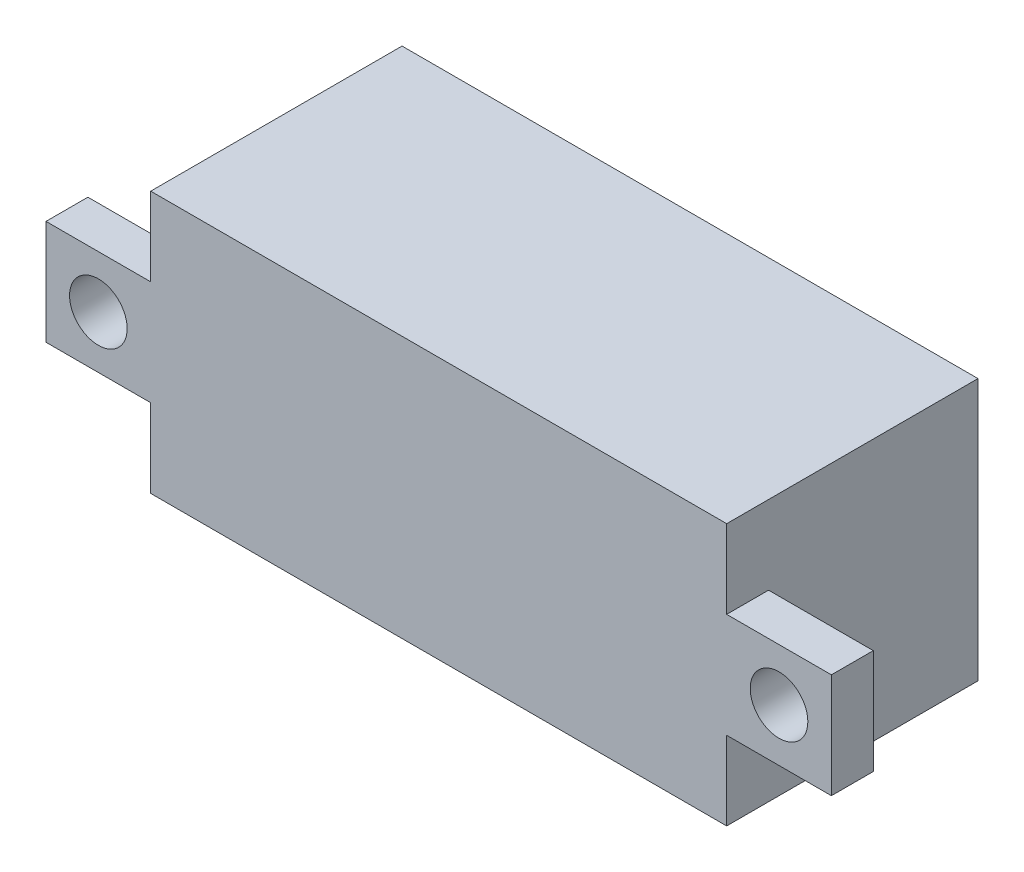
ISO-10303-21;
HEADER;
FILE_DESCRIPTION(('STEP AP214'),'2;1');
FILE_NAME('part.step','',(''),(''),'','','');
FILE_SCHEMA(('AUTOMOTIVE_DESIGN { 1 0 10303 214 1 1 1 1 }'));
ENDSEC;
DATA;
#1=APPLICATION_CONTEXT('core data for automotive mechanical design processes');
#2=APPLICATION_PROTOCOL_DEFINITION('international standard','automotive_design',2000,#1);
#3=PRODUCT_CONTEXT('',#1,'mechanical');
#4=PRODUCT('Part','Part','',(#3));
#5=PRODUCT_RELATED_PRODUCT_CATEGORY('part','',(#4));
#6=PRODUCT_DEFINITION_FORMATION('','',#4);
#7=PRODUCT_DEFINITION_CONTEXT('part definition',#1,'design');
#8=PRODUCT_DEFINITION('design','',#6,#7);
#9=PRODUCT_DEFINITION_SHAPE('','',#8);
#10=(LENGTH_UNIT() NAMED_UNIT(*) SI_UNIT(.MILLI.,.METRE.));
#11=(NAMED_UNIT(*) PLANE_ANGLE_UNIT() SI_UNIT($,.RADIAN.));
#12=(NAMED_UNIT(*) SI_UNIT($,.STERADIAN.) SOLID_ANGLE_UNIT());
#13=UNCERTAINTY_MEASURE_WITH_UNIT(LENGTH_MEASURE(1.E-05),#10,'distance_accuracy_value','');
#14=(GEOMETRIC_REPRESENTATION_CONTEXT(3) GLOBAL_UNCERTAINTY_ASSIGNED_CONTEXT((#13)) GLOBAL_UNIT_ASSIGNED_CONTEXT((#10,
#11,#12)) REPRESENTATION_CONTEXT('',''));
#15=CARTESIAN_POINT('',(0.,0.,0.));
#16=DIRECTION('',(0.,0.,1.));
#17=DIRECTION('',(1.,0.,0.));
#18=AXIS2_PLACEMENT_3D('',#15,#16,#17);
#19=CARTESIAN_POINT('',(0.,0.,8.));
#20=DIRECTION('',(1.,0.,0.));
#21=DIRECTION('',(0.,0.,-1.));
#22=AXIS2_PLACEMENT_3D('',#19,#20,#21);
#23=PLANE('',#22);
#24=DIRECTION('',(0.,-1.,0.));
#25=VECTOR('',#24,1.);
#26=CARTESIAN_POINT('',(0.,0.,0.));
#27=LINE('',#26,#25);
#28=CARTESIAN_POINT('',(0.,10.,0.));
#29=VERTEX_POINT('',#28);
#30=CARTESIAN_POINT('',(0.,0.,0.));
#31=VERTEX_POINT('',#30);
#32=EDGE_CURVE('E157',#29,#31,#27,.T.);
#33=ORIENTED_EDGE('',*,*,#32,.T.);
#34=DIRECTION('',(0.,0.,-1.));
#35=VECTOR('',#34,1.);
#36=CARTESIAN_POINT('',(0.,0.,8.));
#37=LINE('',#36,#35);
#38=CARTESIAN_POINT('',(0.,0.,9.6));
#39=VERTEX_POINT('',#38);
#40=EDGE_CURVE('E11',#39,#31,#37,.T.);
#41=ORIENTED_EDGE('',*,*,#40,.F.);
#42=DIRECTION('',(0.,-1.,0.));
#43=VECTOR('',#42,1.);
#44=CARTESIAN_POINT('',(0.,3.,9.6));
#45=LINE('',#44,#43);
#46=CARTESIAN_POINT('',(0.,3.,9.6));
#47=VERTEX_POINT('',#46);
#48=EDGE_CURVE('E192',#47,#39,#45,.T.);
#49=ORIENTED_EDGE('',*,*,#48,.F.);
#50=DIRECTION('',(0.,0.,-1.));
#51=VECTOR('',#50,1.);
#52=CARTESIAN_POINT('',(0.,3.,9.6));
#53=LINE('',#52,#51);
#54=CARTESIAN_POINT('',(0.,3.,8.));
#55=VERTEX_POINT('',#54);
#56=EDGE_CURVE('E235',#47,#55,#53,.T.);
#57=ORIENTED_EDGE('',*,*,#56,.T.);
#58=DIRECTION('',(0.,-1.,0.));
#59=VECTOR('',#58,1.);
#60=CARTESIAN_POINT('',(0.,0.,8.));
#61=LINE('',#60,#59);
#62=CARTESIAN_POINT('',(0.,7.,8.));
#63=VERTEX_POINT('',#62);
#64=EDGE_CURVE('E155',#63,#55,#61,.T.);
#65=ORIENTED_EDGE('',*,*,#64,.F.);
#66=DIRECTION('',(0.,0.,-1.));
#67=VECTOR('',#66,1.);
#68=CARTESIAN_POINT('',(0.,7.,9.6));
#69=LINE('',#68,#67);
#70=CARTESIAN_POINT('',(0.,7.,9.6));
#71=VERTEX_POINT('',#70);
#72=EDGE_CURVE('E134',#71,#63,#69,.T.);
#73=ORIENTED_EDGE('',*,*,#72,.F.);
#74=DIRECTION('',(0.,-1.,0.));
#75=VECTOR('',#74,1.);
#76=CARTESIAN_POINT('',(0.,10.,9.6));
#77=LINE('',#76,#75);
#78=CARTESIAN_POINT('',(0.,10.,9.6));
#79=VERTEX_POINT('',#78);
#80=EDGE_CURVE('E140',#79,#71,#77,.T.);
#81=ORIENTED_EDGE('',*,*,#80,.F.);
#82=DIRECTION('',(0.,0.,-1.));
#83=VECTOR('',#82,1.);
#84=CARTESIAN_POINT('',(0.,10.,8.));
#85=LINE('',#84,#83);
#86=EDGE_CURVE('E167',#79,#29,#85,.T.);
#87=ORIENTED_EDGE('',*,*,#86,.T.);
#88=EDGE_LOOP('',(#33,#41,#49,#57,#65,#73,#81,#87));
#89=FACE_BOUND('',#88,.T.);
#90=ADVANCED_FACE('F41',(#89),#23,.F.);
#91=CARTESIAN_POINT('',(0.,0.,8.));
#92=DIRECTION('',(0.,1.,0.));
#93=DIRECTION('',(0.,0.,1.));
#94=AXIS2_PLACEMENT_3D('',#91,#92,#93);
#95=PLANE('',#94);
#96=DIRECTION('',(1.,0.,0.));
#97=VECTOR('',#96,1.);
#98=CARTESIAN_POINT('',(0.,0.,0.));
#99=LINE('',#98,#97);
#100=CARTESIAN_POINT('',(22.,0.,0.));
#101=VERTEX_POINT('',#100);
#102=EDGE_CURVE('E159',#31,#101,#99,.T.);
#103=ORIENTED_EDGE('',*,*,#102,.T.);
#104=DIRECTION('',(0.,0.,-1.));
#105=VECTOR('',#104,1.);
#106=CARTESIAN_POINT('',(22.,0.,8.));
#107=LINE('',#106,#105);
#108=CARTESIAN_POINT('',(22.,0.,9.6));
#109=VERTEX_POINT('',#108);
#110=EDGE_CURVE('E48',#109,#101,#107,.T.);
#111=ORIENTED_EDGE('',*,*,#110,.F.);
#112=DIRECTION('',(1.,0.,0.));
#113=VECTOR('',#112,1.);
#114=CARTESIAN_POINT('',(0.,0.,9.6));
#115=LINE('',#114,#113);
#116=EDGE_CURVE('E193',#39,#109,#115,.T.);
#117=ORIENTED_EDGE('',*,*,#116,.F.);
#118=ORIENTED_EDGE('',*,*,#40,.T.);
#119=EDGE_LOOP('',(#103,#111,#117,#118));
#120=FACE_BOUND('',#119,.T.);
#121=ADVANCED_FACE('F198',(#120),#95,.F.);
#122=CARTESIAN_POINT('',(22.,0.,8.));
#123=DIRECTION('',(-1.,0.,0.));
#124=DIRECTION('',(0.,0.,1.));
#125=AXIS2_PLACEMENT_3D('',#122,#123,#124);
#126=PLANE('',#125);
#127=DIRECTION('',(0.,1.,0.));
#128=VECTOR('',#127,1.);
#129=CARTESIAN_POINT('',(22.,0.,0.));
#130=LINE('',#129,#128);
#131=CARTESIAN_POINT('',(22.,10.,0.));
#132=VERTEX_POINT('',#131);
#133=EDGE_CURVE('E170',#101,#132,#130,.T.);
#134=ORIENTED_EDGE('',*,*,#133,.T.);
#135=DIRECTION('',(0.,0.,-1.));
#136=VECTOR('',#135,1.);
#137=CARTESIAN_POINT('',(22.,10.,8.));
#138=LINE('',#137,#136);
#139=CARTESIAN_POINT('',(22.,10.,9.6));
#140=VERTEX_POINT('',#139);
#141=EDGE_CURVE('E174',#140,#132,#138,.T.);
#142=ORIENTED_EDGE('',*,*,#141,.F.);
#143=DIRECTION('',(0.,1.,0.));
#144=VECTOR('',#143,1.);
#145=CARTESIAN_POINT('',(22.,7.,9.6));
#146=LINE('',#145,#144);
#147=CARTESIAN_POINT('',(22.,7.,9.6));
#148=VERTEX_POINT('',#147);
#149=EDGE_CURVE('E209',#148,#140,#146,.T.);
#150=ORIENTED_EDGE('',*,*,#149,.F.);
#151=DIRECTION('',(0.,0.,-1.));
#152=VECTOR('',#151,1.);
#153=CARTESIAN_POINT('',(22.,7.,9.6));
#154=LINE('',#153,#152);
#155=CARTESIAN_POINT('',(22.,7.,8.));
#156=VERTEX_POINT('',#155);
#157=EDGE_CURVE('E212',#148,#156,#154,.T.);
#158=ORIENTED_EDGE('',*,*,#157,.T.);
#159=DIRECTION('',(0.,1.,0.));
#160=VECTOR('',#159,1.);
#161=CARTESIAN_POINT('',(22.,0.,8.));
#162=LINE('',#161,#160);
#163=CARTESIAN_POINT('',(22.,3.,8.));
#164=VERTEX_POINT('',#163);
#165=EDGE_CURVE('E55',#164,#156,#162,.T.);
#166=ORIENTED_EDGE('',*,*,#165,.F.);
#167=DIRECTION('',(0.,0.,-1.));
#168=VECTOR('',#167,1.);
#169=CARTESIAN_POINT('',(22.,3.,9.6));
#170=LINE('',#169,#168);
#171=CARTESIAN_POINT('',(22.,3.,9.6));
#172=VERTEX_POINT('',#171);
#173=EDGE_CURVE('E233',#172,#164,#170,.T.);
#174=ORIENTED_EDGE('',*,*,#173,.F.);
#175=DIRECTION('',(0.,1.,0.));
#176=VECTOR('',#175,1.);
#177=CARTESIAN_POINT('',(22.,0.,9.6));
#178=LINE('',#177,#176);
#179=EDGE_CURVE('E180',#109,#172,#178,.T.);
#180=ORIENTED_EDGE('',*,*,#179,.F.);
#181=ORIENTED_EDGE('',*,*,#110,.T.);
#182=EDGE_LOOP('',(#134,#142,#150,#158,#166,#174,#180,#181));
#183=FACE_BOUND('',#182,.T.);
#184=ADVANCED_FACE('F179',(#183),#126,.F.);
#185=CARTESIAN_POINT('',(0.,10.,8.));
#186=DIRECTION('',(0.,-1.,0.));
#187=DIRECTION('',(0.,0.,-1.));
#188=AXIS2_PLACEMENT_3D('',#185,#186,#187);
#189=PLANE('',#188);
#190=DIRECTION('',(-1.,0.,0.));
#191=VECTOR('',#190,1.);
#192=CARTESIAN_POINT('',(0.,10.,0.));
#193=LINE('',#192,#191);
#194=EDGE_CURVE('E166',#132,#29,#193,.T.);
#195=ORIENTED_EDGE('',*,*,#194,.T.);
#196=ORIENTED_EDGE('',*,*,#86,.F.);
#197=DIRECTION('',(-1.,0.,0.));
#198=VECTOR('',#197,1.);
#199=CARTESIAN_POINT('',(22.,10.,9.6));
#200=LINE('',#199,#198);
#201=EDGE_CURVE('E148',#140,#79,#200,.T.);
#202=ORIENTED_EDGE('',*,*,#201,.F.);
#203=ORIENTED_EDGE('',*,*,#141,.T.);
#204=EDGE_LOOP('',(#195,#196,#202,#203));
#205=FACE_BOUND('',#204,.T.);
#206=ADVANCED_FACE('F189',(#205),#189,.F.);
#207=CARTESIAN_POINT('',(0.,0.,0.));
#208=DIRECTION('',(0.,0.,-1.));
#209=DIRECTION('',(-1.,0.,0.));
#210=AXIS2_PLACEMENT_3D('',#207,#208,#209);
#211=PLANE('',#210);
#212=ORIENTED_EDGE('',*,*,#32,.F.);
#213=ORIENTED_EDGE('',*,*,#194,.F.);
#214=ORIENTED_EDGE('',*,*,#133,.F.);
#215=ORIENTED_EDGE('',*,*,#102,.F.);
#216=EDGE_LOOP('',(#212,#213,#214,#215));
#217=FACE_BOUND('',#216,.T.);
#218=ADVANCED_FACE('F187',(#217),#211,.T.);
#219=CARTESIAN_POINT('',(0.,0.,8.));
#220=DIRECTION('',(0.,0.,-1.));
#221=DIRECTION('',(-1.,0.,0.));
#222=AXIS2_PLACEMENT_3D('',#219,#220,#221);
#223=PLANE('',#222);
#224=CARTESIAN_POINT('',(-2.,5.,8.));
#225=DIRECTION('',(0.,0.,1.));
#226=DIRECTION('',(1.,0.,0.));
#227=AXIS2_PLACEMENT_3D('',#224,#225,#226);
#228=CIRCLE('',#227,1.1);
#229=CARTESIAN_POINT('',(-0.9,5.,8.));
#230=VERTEX_POINT('',#229);
#231=EDGE_CURVE('E248',#230,#230,#228,.T.);
#232=ORIENTED_EDGE('',*,*,#231,.T.);
#233=EDGE_LOOP('',(#232));
#234=FACE_BOUND('',#233,.T.);
#235=DIRECTION('',(-1.,0.,0.));
#236=VECTOR('',#235,1.);
#237=CARTESIAN_POINT('',(0.,7.,8.));
#238=LINE('',#237,#236);
#239=CARTESIAN_POINT('',(-4.,7.,8.));
#240=VERTEX_POINT('',#239);
#241=EDGE_CURVE('E213',#63,#240,#238,.T.);
#242=ORIENTED_EDGE('',*,*,#241,.F.);
#243=ORIENTED_EDGE('',*,*,#64,.T.);
#244=DIRECTION('',(1.,0.,0.));
#245=VECTOR('',#244,1.);
#246=CARTESIAN_POINT('',(0.,3.,8.));
#247=LINE('',#246,#245);
#248=CARTESIAN_POINT('',(-4.,3.,8.));
#249=VERTEX_POINT('',#248);
#250=EDGE_CURVE('E218',#249,#55,#247,.T.);
#251=ORIENTED_EDGE('',*,*,#250,.F.);
#252=DIRECTION('',(0.,-1.,0.));
#253=VECTOR('',#252,1.);
#254=CARTESIAN_POINT('',(-4.,7.,8.));
#255=LINE('',#254,#253);
#256=EDGE_CURVE('E215',#240,#249,#255,.T.);
#257=ORIENTED_EDGE('',*,*,#256,.F.);
#258=EDGE_LOOP('',(#242,#243,#251,#257));
#259=FACE_BOUND('',#258,.T.);
#260=ADVANCED_FACE('F244',(#234,#259),#223,.T.);
#261=CARTESIAN_POINT('',(0.,0.,9.6));
#262=DIRECTION('',(0.,0.,-1.));
#263=DIRECTION('',(-1.,0.,0.));
#264=AXIS2_PLACEMENT_3D('',#261,#262,#263);
#265=PLANE('',#264);
#266=ORIENTED_EDGE('',*,*,#80,.T.);
#267=DIRECTION('',(-1.,0.,0.));
#268=VECTOR('',#267,1.);
#269=CARTESIAN_POINT('',(0.,7.,9.6));
#270=LINE('',#269,#268);
#271=CARTESIAN_POINT('',(-4.,7.,9.6));
#272=VERTEX_POINT('',#271);
#273=EDGE_CURVE('E130',#71,#272,#270,.T.);
#274=ORIENTED_EDGE('',*,*,#273,.T.);
#275=DIRECTION('',(0.,-1.,0.));
#276=VECTOR('',#275,1.);
#277=CARTESIAN_POINT('',(-4.,7.,9.6));
#278=LINE('',#277,#276);
#279=CARTESIAN_POINT('',(-4.,3.,9.6));
#280=VERTEX_POINT('',#279);
#281=EDGE_CURVE('E139',#272,#280,#278,.T.);
#282=ORIENTED_EDGE('',*,*,#281,.T.);
#283=DIRECTION('',(1.,0.,0.));
#284=VECTOR('',#283,1.);
#285=CARTESIAN_POINT('',(0.,3.,9.6));
#286=LINE('',#285,#284);
#287=EDGE_CURVE('E195',#280,#47,#286,.T.);
#288=ORIENTED_EDGE('',*,*,#287,.T.);
#289=ORIENTED_EDGE('',*,*,#48,.T.);
#290=ORIENTED_EDGE('',*,*,#116,.T.);
#291=ORIENTED_EDGE('',*,*,#179,.T.);
#292=DIRECTION('',(1.,0.,0.));
#293=VECTOR('',#292,1.);
#294=CARTESIAN_POINT('',(22.,3.,9.6));
#295=LINE('',#294,#293);
#296=CARTESIAN_POINT('',(26.,3.,9.6));
#297=VERTEX_POINT('',#296);
#298=EDGE_CURVE('E200',#172,#297,#295,.T.);
#299=ORIENTED_EDGE('',*,*,#298,.T.);
#300=DIRECTION('',(0.,1.,0.));
#301=VECTOR('',#300,1.);
#302=CARTESIAN_POINT('',(26.,7.,9.6));
#303=LINE('',#302,#301);
#304=CARTESIAN_POINT('',(26.,7.,9.6));
#305=VERTEX_POINT('',#304);
#306=EDGE_CURVE('E205',#297,#305,#303,.T.);
#307=ORIENTED_EDGE('',*,*,#306,.T.);
#308=DIRECTION('',(-1.,0.,0.));
#309=VECTOR('',#308,1.);
#310=CARTESIAN_POINT('',(22.,7.,9.6));
#311=LINE('',#310,#309);
#312=EDGE_CURVE('E207',#305,#148,#311,.T.);
#313=ORIENTED_EDGE('',*,*,#312,.T.);
#314=ORIENTED_EDGE('',*,*,#149,.T.);
#315=ORIENTED_EDGE('',*,*,#201,.T.);
#316=EDGE_LOOP('',(#266,#274,#282,#288,#289,#290,#291,#299,#307,#313,#314,#315));
#317=FACE_BOUND('',#316,.T.);
#318=CARTESIAN_POINT('',(-2.,5.,9.6));
#319=DIRECTION('',(0.,0.,1.));
#320=DIRECTION('',(1.,0.,0.));
#321=AXIS2_PLACEMENT_3D('',#318,#319,#320);
#322=CIRCLE('',#321,1.1);
#323=CARTESIAN_POINT('',(-0.9,5.,9.6));
#324=VERTEX_POINT('',#323);
#325=EDGE_CURVE('E216',#324,#324,#322,.T.);
#326=ORIENTED_EDGE('',*,*,#325,.F.);
#327=EDGE_LOOP('',(#326));
#328=FACE_BOUND('',#327,.T.);
#329=CARTESIAN_POINT('',(24.,5.,9.6));
#330=DIRECTION('',(0.,0.,1.));
#331=DIRECTION('',(1.,0.,0.));
#332=AXIS2_PLACEMENT_3D('',#329,#330,#331);
#333=CIRCLE('',#332,1.1);
#334=CARTESIAN_POINT('',(25.1,5.,9.6));
#335=VERTEX_POINT('',#334);
#336=EDGE_CURVE('E251',#335,#335,#333,.T.);
#337=ORIENTED_EDGE('',*,*,#336,.F.);
#338=EDGE_LOOP('',(#337));
#339=FACE_BOUND('',#338,.T.);
#340=ADVANCED_FACE('F144',(#317,#328,#339),#265,.F.);
#341=DIRECTION('',(1.,0.,0.));
#342=VECTOR('',#341,1.);
#343=CARTESIAN_POINT('',(22.,3.,8.));
#344=LINE('',#343,#342);
#345=CARTESIAN_POINT('',(26.,3.,8.));
#346=VERTEX_POINT('',#345);
#347=EDGE_CURVE('E221',#164,#346,#344,.T.);
#348=ORIENTED_EDGE('',*,*,#347,.F.);
#349=ORIENTED_EDGE('',*,*,#165,.T.);
#350=DIRECTION('',(-1.,0.,0.));
#351=VECTOR('',#350,1.);
#352=CARTESIAN_POINT('',(22.,7.,8.));
#353=LINE('',#352,#351);
#354=CARTESIAN_POINT('',(26.,7.,8.));
#355=VERTEX_POINT('',#354);
#356=EDGE_CURVE('E151',#355,#156,#353,.T.);
#357=ORIENTED_EDGE('',*,*,#356,.F.);
#358=DIRECTION('',(0.,1.,0.));
#359=VECTOR('',#358,1.);
#360=CARTESIAN_POINT('',(26.,7.,8.));
#361=LINE('',#360,#359);
#362=EDGE_CURVE('E223',#346,#355,#361,.T.);
#363=ORIENTED_EDGE('',*,*,#362,.F.);
#364=EDGE_LOOP('',(#348,#349,#357,#363));
#365=FACE_BOUND('',#364,.T.);
#366=CARTESIAN_POINT('',(24.,5.,8.));
#367=DIRECTION('',(0.,0.,1.));
#368=DIRECTION('',(1.,0.,0.));
#369=AXIS2_PLACEMENT_3D('',#366,#367,#368);
#370=CIRCLE('',#369,1.1);
#371=CARTESIAN_POINT('',(25.1,5.,8.));
#372=VERTEX_POINT('',#371);
#373=EDGE_CURVE('E254',#372,#372,#370,.T.);
#374=ORIENTED_EDGE('',*,*,#373,.T.);
#375=EDGE_LOOP('',(#374));
#376=FACE_BOUND('',#375,.T.);
#377=ADVANCED_FACE('F264',(#365,#376),#223,.T.);
#378=CARTESIAN_POINT('',(0.,7.,9.6));
#379=DIRECTION('',(0.,-1.,0.));
#380=DIRECTION('',(1.,0.,0.));
#381=AXIS2_PLACEMENT_3D('',#378,#379,#380);
#382=PLANE('',#381);
#383=ORIENTED_EDGE('',*,*,#241,.T.);
#384=DIRECTION('',(0.,0.,-1.));
#385=VECTOR('',#384,1.);
#386=CARTESIAN_POINT('',(-4.,7.,9.6));
#387=LINE('',#386,#385);
#388=EDGE_CURVE('E136',#272,#240,#387,.T.);
#389=ORIENTED_EDGE('',*,*,#388,.F.);
#390=ORIENTED_EDGE('',*,*,#273,.F.);
#391=ORIENTED_EDGE('',*,*,#72,.T.);
#392=EDGE_LOOP('',(#383,#389,#390,#391));
#393=FACE_BOUND('',#392,.T.);
#394=ADVANCED_FACE('F132',(#393),#382,.F.);
#395=CARTESIAN_POINT('',(-4.,7.,9.6));
#396=DIRECTION('',(1.,0.,0.));
#397=DIRECTION('',(0.,1.,0.));
#398=AXIS2_PLACEMENT_3D('',#395,#396,#397);
#399=PLANE('',#398);
#400=ORIENTED_EDGE('',*,*,#256,.T.);
#401=DIRECTION('',(0.,0.,-1.));
#402=VECTOR('',#401,1.);
#403=CARTESIAN_POINT('',(-4.,3.,9.6));
#404=LINE('',#403,#402);
#405=EDGE_CURVE('E161',#280,#249,#404,.T.);
#406=ORIENTED_EDGE('',*,*,#405,.F.);
#407=ORIENTED_EDGE('',*,*,#281,.F.);
#408=ORIENTED_EDGE('',*,*,#388,.T.);
#409=EDGE_LOOP('',(#400,#406,#407,#408));
#410=FACE_BOUND('',#409,.T.);
#411=ADVANCED_FACE('F245',(#410),#399,.F.);
#412=CARTESIAN_POINT('',(0.,3.,9.6));
#413=DIRECTION('',(0.,1.,0.));
#414=DIRECTION('',(-1.,0.,0.));
#415=AXIS2_PLACEMENT_3D('',#412,#413,#414);
#416=PLANE('',#415);
#417=ORIENTED_EDGE('',*,*,#250,.T.);
#418=ORIENTED_EDGE('',*,*,#56,.F.);
#419=ORIENTED_EDGE('',*,*,#287,.F.);
#420=ORIENTED_EDGE('',*,*,#405,.T.);
#421=EDGE_LOOP('',(#417,#418,#419,#420));
#422=FACE_BOUND('',#421,.T.);
#423=ADVANCED_FACE('F240',(#422),#416,.F.);
#424=CARTESIAN_POINT('',(22.,3.,9.6));
#425=DIRECTION('',(0.,1.,0.));
#426=DIRECTION('',(0.,0.,1.));
#427=AXIS2_PLACEMENT_3D('',#424,#425,#426);
#428=PLANE('',#427);
#429=ORIENTED_EDGE('',*,*,#347,.T.);
#430=DIRECTION('',(0.,0.,-1.));
#431=VECTOR('',#430,1.);
#432=CARTESIAN_POINT('',(26.,3.,9.6));
#433=LINE('',#432,#431);
#434=EDGE_CURVE('E230',#297,#346,#433,.T.);
#435=ORIENTED_EDGE('',*,*,#434,.F.);
#436=ORIENTED_EDGE('',*,*,#298,.F.);
#437=ORIENTED_EDGE('',*,*,#173,.T.);
#438=EDGE_LOOP('',(#429,#435,#436,#437));
#439=FACE_BOUND('',#438,.T.);
#440=ADVANCED_FACE('F292',(#439),#428,.F.);
#441=CARTESIAN_POINT('',(26.,7.,9.6));
#442=DIRECTION('',(-1.,0.,0.));
#443=DIRECTION('',(0.,0.,1.));
#444=AXIS2_PLACEMENT_3D('',#441,#442,#443);
#445=PLANE('',#444);
#446=ORIENTED_EDGE('',*,*,#362,.T.);
#447=DIRECTION('',(0.,0.,-1.));
#448=VECTOR('',#447,1.);
#449=CARTESIAN_POINT('',(26.,7.,9.6));
#450=LINE('',#449,#448);
#451=EDGE_CURVE('E227',#305,#355,#450,.T.);
#452=ORIENTED_EDGE('',*,*,#451,.F.);
#453=ORIENTED_EDGE('',*,*,#306,.F.);
#454=ORIENTED_EDGE('',*,*,#434,.T.);
#455=EDGE_LOOP('',(#446,#452,#453,#454));
#456=FACE_BOUND('',#455,.T.);
#457=ADVANCED_FACE('F295',(#456),#445,.F.);
#458=CARTESIAN_POINT('',(22.,7.,9.6));
#459=DIRECTION('',(0.,-1.,0.));
#460=DIRECTION('',(0.,0.,-1.));
#461=AXIS2_PLACEMENT_3D('',#458,#459,#460);
#462=PLANE('',#461);
#463=ORIENTED_EDGE('',*,*,#356,.T.);
#464=ORIENTED_EDGE('',*,*,#157,.F.);
#465=ORIENTED_EDGE('',*,*,#312,.F.);
#466=ORIENTED_EDGE('',*,*,#451,.T.);
#467=EDGE_LOOP('',(#463,#464,#465,#466));
#468=FACE_BOUND('',#467,.T.);
#469=ADVANCED_FACE('F299',(#468),#462,.F.);
#470=CARTESIAN_POINT('',(-2.,5.,9.6));
#471=DIRECTION('',(0.,0.,-1.));
#472=DIRECTION('',(-1.,0.,0.));
#473=AXIS2_PLACEMENT_3D('',#470,#471,#472);
#474=CYLINDRICAL_SURFACE('',#473,1.1);
#475=ORIENTED_EDGE('',*,*,#325,.T.);
#476=EDGE_LOOP('',(#475));
#477=FACE_BOUND('',#476,.T.);
#478=ORIENTED_EDGE('',*,*,#231,.F.);
#479=EDGE_LOOP('',(#478));
#480=FACE_BOUND('',#479,.T.);
#481=ADVANCED_FACE('F302',(#477,#480),#474,.F.);
#482=CARTESIAN_POINT('',(24.,5.,9.6));
#483=DIRECTION('',(0.,0.,-1.));
#484=DIRECTION('',(-1.,0.,0.));
#485=AXIS2_PLACEMENT_3D('',#482,#483,#484);
#486=CYLINDRICAL_SURFACE('',#485,1.1);
#487=ORIENTED_EDGE('',*,*,#336,.T.);
#488=EDGE_LOOP('',(#487));
#489=FACE_BOUND('',#488,.T.);
#490=ORIENTED_EDGE('',*,*,#373,.F.);
#491=EDGE_LOOP('',(#490));
#492=FACE_BOUND('',#491,.T.);
#493=ADVANCED_FACE('F260',(#489,#492),#486,.F.);
#494=CLOSED_SHELL('',(#90,#121,#184,#206,#218,#260,#340,#377,#394,#411,#423,#440,#457,#469,#481,#493));
#495=MANIFOLD_SOLID_BREP('B2',#494);
#496=ADVANCED_BREP_SHAPE_REPRESENTATION('',(#18,#495),#14);
#497=SHAPE_DEFINITION_REPRESENTATION(#9,#496);
ENDSEC;
END-ISO-10303-21;
